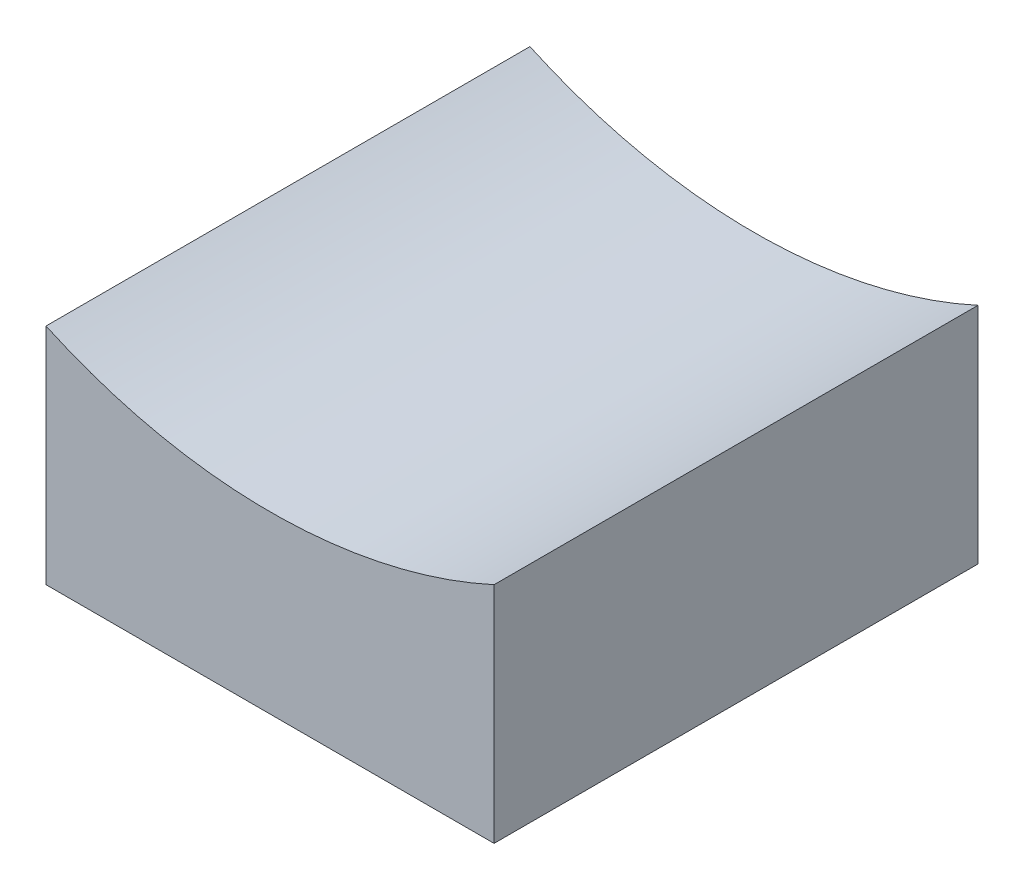
ISO-10303-21;
HEADER;
FILE_DESCRIPTION(('STEP AP214'),'2;1');
FILE_NAME('part.step','',(''),(''),'','','');
FILE_SCHEMA(('AUTOMOTIVE_DESIGN { 1 0 10303 214 1 1 1 1 }'));
ENDSEC;
DATA;
#1=APPLICATION_CONTEXT('core data for automotive mechanical design processes');
#2=APPLICATION_PROTOCOL_DEFINITION('international standard','automotive_design',2000,#1);
#3=PRODUCT_CONTEXT('',#1,'mechanical');
#4=PRODUCT('Part','Part','',(#3));
#5=PRODUCT_RELATED_PRODUCT_CATEGORY('part','',(#4));
#6=PRODUCT_DEFINITION_FORMATION('','',#4);
#7=PRODUCT_DEFINITION_CONTEXT('part definition',#1,'design');
#8=PRODUCT_DEFINITION('design','',#6,#7);
#9=PRODUCT_DEFINITION_SHAPE('','',#8);
#10=(LENGTH_UNIT() NAMED_UNIT(*) SI_UNIT(.MILLI.,.METRE.));
#11=(NAMED_UNIT(*) PLANE_ANGLE_UNIT() SI_UNIT($,.RADIAN.));
#12=(NAMED_UNIT(*) SI_UNIT($,.STERADIAN.) SOLID_ANGLE_UNIT());
#13=UNCERTAINTY_MEASURE_WITH_UNIT(LENGTH_MEASURE(1.E-05),#10,'distance_accuracy_value','');
#14=(GEOMETRIC_REPRESENTATION_CONTEXT(3) GLOBAL_UNCERTAINTY_ASSIGNED_CONTEXT((#13)) GLOBAL_UNIT_ASSIGNED_CONTEXT((#10,
#11,#12)) REPRESENTATION_CONTEXT('',''));
#15=CARTESIAN_POINT('',(0.,0.,0.));
#16=DIRECTION('',(0.,0.,1.));
#17=DIRECTION('',(1.,0.,0.));
#18=AXIS2_PLACEMENT_3D('',#15,#16,#17);
#19=CARTESIAN_POINT('',(0.,0.,54.));
#20=DIRECTION('',(1.,0.,0.));
#21=DIRECTION('',(0.,0.,-1.));
#22=AXIS2_PLACEMENT_3D('',#19,#20,#21);
#23=PLANE('',#22);
#24=DIRECTION('',(0.,-1.,0.));
#25=VECTOR('',#24,1.);
#26=CARTESIAN_POINT('',(0.,0.,0.));
#27=LINE('',#26,#25);
#28=CARTESIAN_POINT('',(0.,25.,0.));
#29=VERTEX_POINT('',#28);
#30=CARTESIAN_POINT('',(0.,0.,0.));
#31=VERTEX_POINT('',#30);
#32=EDGE_CURVE('E105',#29,#31,#27,.T.);
#33=ORIENTED_EDGE('',*,*,#32,.T.);
#34=DIRECTION('',(0.,0.,-1.));
#35=VECTOR('',#34,1.);
#36=CARTESIAN_POINT('',(0.,0.,54.));
#37=LINE('',#36,#35);
#38=CARTESIAN_POINT('',(0.,0.,54.));
#39=VERTEX_POINT('',#38);
#40=EDGE_CURVE('E11',#39,#31,#37,.T.);
#41=ORIENTED_EDGE('',*,*,#40,.F.);
#42=DIRECTION('',(0.,-1.,0.));
#43=VECTOR('',#42,1.);
#44=CARTESIAN_POINT('',(0.,0.,54.));
#45=LINE('',#44,#43);
#46=CARTESIAN_POINT('',(0.,25.,54.));
#47=VERTEX_POINT('',#46);
#48=EDGE_CURVE('E89',#47,#39,#45,.T.);
#49=ORIENTED_EDGE('',*,*,#48,.F.);
#50=DIRECTION('',(0.,0.,-1.));
#51=VECTOR('',#50,1.);
#52=CARTESIAN_POINT('',(0.,25.,54.));
#53=LINE('',#52,#51);
#54=EDGE_CURVE('E97',#47,#29,#53,.T.);
#55=ORIENTED_EDGE('',*,*,#54,.T.);
#56=EDGE_LOOP('',(#33,#41,#49,#55));
#57=FACE_BOUND('',#56,.T.);
#58=ADVANCED_FACE('F39',(#57),#23,.F.);
#59=CARTESIAN_POINT('',(0.,0.,54.));
#60=DIRECTION('',(0.,1.,0.));
#61=DIRECTION('',(0.,0.,1.));
#62=AXIS2_PLACEMENT_3D('',#59,#60,#61);
#63=PLANE('',#62);
#64=DIRECTION('',(1.,0.,0.));
#65=VECTOR('',#64,1.);
#66=CARTESIAN_POINT('',(0.,0.,0.));
#67=LINE('',#66,#65);
#68=CARTESIAN_POINT('',(50.,0.,0.));
#69=VERTEX_POINT('',#68);
#70=EDGE_CURVE('E92',#31,#69,#67,.T.);
#71=ORIENTED_EDGE('',*,*,#70,.T.);
#72=DIRECTION('',(0.,0.,-1.));
#73=VECTOR('',#72,1.);
#74=CARTESIAN_POINT('',(50.,0.,54.));
#75=LINE('',#74,#73);
#76=CARTESIAN_POINT('',(50.,0.,54.));
#77=VERTEX_POINT('',#76);
#78=EDGE_CURVE('E50',#77,#69,#75,.T.);
#79=ORIENTED_EDGE('',*,*,#78,.F.);
#80=DIRECTION('',(1.,0.,0.));
#81=VECTOR('',#80,1.);
#82=CARTESIAN_POINT('',(0.,0.,54.));
#83=LINE('',#82,#81);
#84=EDGE_CURVE('E82',#39,#77,#83,.T.);
#85=ORIENTED_EDGE('',*,*,#84,.F.);
#86=ORIENTED_EDGE('',*,*,#40,.T.);
#87=EDGE_LOOP('',(#71,#79,#85,#86));
#88=FACE_BOUND('',#87,.T.);
#89=ADVANCED_FACE('F93',(#88),#63,.F.);
#90=CARTESIAN_POINT('',(50.,0.,54.));
#91=DIRECTION('',(-1.,0.,0.));
#92=DIRECTION('',(0.,0.,1.));
#93=AXIS2_PLACEMENT_3D('',#90,#91,#92);
#94=PLANE('',#93);
#95=DIRECTION('',(0.,1.,0.));
#96=VECTOR('',#95,1.);
#97=CARTESIAN_POINT('',(50.,0.,0.));
#98=LINE('',#97,#96);
#99=CARTESIAN_POINT('',(50.,25.,0.));
#100=VERTEX_POINT('',#99);
#101=EDGE_CURVE('E72',#69,#100,#98,.T.);
#102=ORIENTED_EDGE('',*,*,#101,.T.);
#103=DIRECTION('',(0.,0.,-1.));
#104=VECTOR('',#103,1.);
#105=CARTESIAN_POINT('',(50.,25.,54.));
#106=LINE('',#105,#104);
#107=CARTESIAN_POINT('',(50.,25.,54.));
#108=VERTEX_POINT('',#107);
#109=EDGE_CURVE('E94',#108,#100,#106,.T.);
#110=ORIENTED_EDGE('',*,*,#109,.F.);
#111=DIRECTION('',(0.,1.,0.));
#112=VECTOR('',#111,1.);
#113=CARTESIAN_POINT('',(50.,0.,54.));
#114=LINE('',#113,#112);
#115=EDGE_CURVE('E88',#77,#108,#114,.T.);
#116=ORIENTED_EDGE('',*,*,#115,.F.);
#117=ORIENTED_EDGE('',*,*,#78,.T.);
#118=EDGE_LOOP('',(#102,#110,#116,#117));
#119=FACE_BOUND('',#118,.T.);
#120=ADVANCED_FACE('F96',(#119),#94,.F.);
#121=CARTESIAN_POINT('',(25.,79.5435605731786,54.));
#122=DIRECTION('',(0.,0.,-1.));
#123=DIRECTION('',(-1.,0.,0.));
#124=AXIS2_PLACEMENT_3D('',#121,#122,#123);
#125=CYLINDRICAL_SURFACE('',#124,60.);
#126=CARTESIAN_POINT('',(25.,79.5435605731786,0.));
#127=DIRECTION('',(0.,0.,-1.));
#128=DIRECTION('',(1.,0.,0.));
#129=AXIS2_PLACEMENT_3D('',#126,#127,#128);
#130=CIRCLE('',#129,60.);
#131=EDGE_CURVE('E76',#100,#29,#130,.T.);
#132=ORIENTED_EDGE('',*,*,#131,.T.);
#133=ORIENTED_EDGE('',*,*,#54,.F.);
#134=CARTESIAN_POINT('',(25.,79.5435605731786,54.));
#135=DIRECTION('',(0.,0.,-1.));
#136=DIRECTION('',(1.,0.,0.));
#137=AXIS2_PLACEMENT_3D('',#134,#135,#136);
#138=CIRCLE('',#137,60.);
#139=EDGE_CURVE('E54',#108,#47,#138,.T.);
#140=ORIENTED_EDGE('',*,*,#139,.F.);
#141=ORIENTED_EDGE('',*,*,#109,.T.);
#142=EDGE_LOOP('',(#132,#133,#140,#141));
#143=FACE_BOUND('',#142,.T.);
#144=ADVANCED_FACE('F108',(#143),#125,.F.);
#145=CARTESIAN_POINT('',(25.,79.5435605731786,54.));
#146=DIRECTION('',(0.,0.,1.));
#147=DIRECTION('',(1.,0.,0.));
#148=AXIS2_PLACEMENT_3D('',#145,#146,#147);
#149=PLANE('',#148);
#150=ORIENTED_EDGE('',*,*,#48,.T.);
#151=ORIENTED_EDGE('',*,*,#84,.T.);
#152=ORIENTED_EDGE('',*,*,#115,.T.);
#153=ORIENTED_EDGE('',*,*,#139,.T.);
#154=EDGE_LOOP('',(#150,#151,#152,#153));
#155=FACE_BOUND('',#154,.T.);
#156=ADVANCED_FACE('F86',(#155),#149,.T.);
#157=CARTESIAN_POINT('',(25.,79.5435605731786,0.));
#158=DIRECTION('',(0.,0.,1.));
#159=DIRECTION('',(1.,0.,0.));
#160=AXIS2_PLACEMENT_3D('',#157,#158,#159);
#161=PLANE('',#160);
#162=ORIENTED_EDGE('',*,*,#32,.F.);
#163=ORIENTED_EDGE('',*,*,#131,.F.);
#164=ORIENTED_EDGE('',*,*,#101,.F.);
#165=ORIENTED_EDGE('',*,*,#70,.F.);
#166=EDGE_LOOP('',(#162,#163,#164,#165));
#167=FACE_BOUND('',#166,.T.);
#168=ADVANCED_FACE('F115',(#167),#161,.F.);
#169=CLOSED_SHELL('',(#58,#89,#120,#144,#156,#168));
#170=MANIFOLD_SOLID_BREP('B2',#169);
#171=ADVANCED_BREP_SHAPE_REPRESENTATION('',(#18,#170),#14);
#172=SHAPE_DEFINITION_REPRESENTATION(#9,#171);
ENDSEC;
END-ISO-10303-21;
